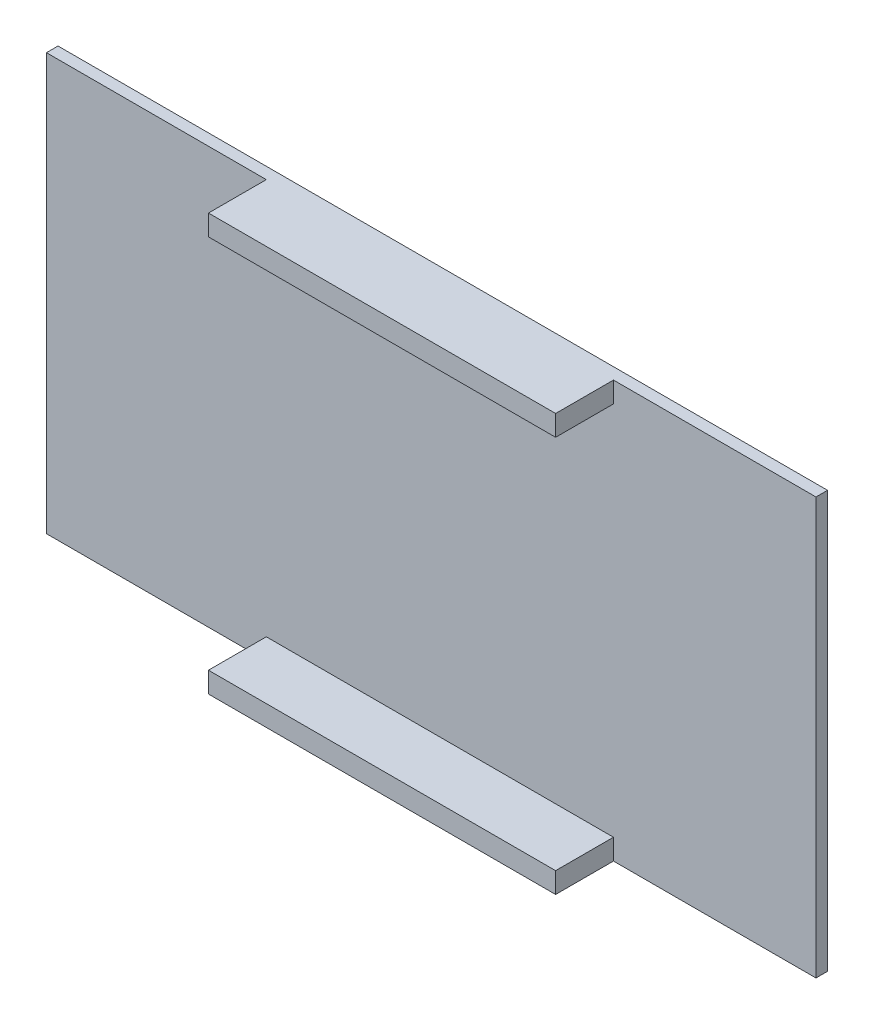
ISO-10303-21;
HEADER;
FILE_DESCRIPTION(('STEP AP214'),'2;1');
FILE_NAME('part.step','',(''),(''),'','','');
FILE_SCHEMA(('AUTOMOTIVE_DESIGN { 1 0 10303 214 1 1 1 1 }'));
ENDSEC;
DATA;
#1=APPLICATION_CONTEXT('core data for automotive mechanical design processes');
#2=APPLICATION_PROTOCOL_DEFINITION('international standard','automotive_design',2000,#1);
#3=PRODUCT_CONTEXT('',#1,'mechanical');
#4=PRODUCT('Part','Part','',(#3));
#5=PRODUCT_RELATED_PRODUCT_CATEGORY('part','',(#4));
#6=PRODUCT_DEFINITION_FORMATION('','',#4);
#7=PRODUCT_DEFINITION_CONTEXT('part definition',#1,'design');
#8=PRODUCT_DEFINITION('design','',#6,#7);
#9=PRODUCT_DEFINITION_SHAPE('','',#8);
#10=(LENGTH_UNIT() NAMED_UNIT(*) SI_UNIT(.MILLI.,.METRE.));
#11=(NAMED_UNIT(*) PLANE_ANGLE_UNIT() SI_UNIT($,.RADIAN.));
#12=(NAMED_UNIT(*) SI_UNIT($,.STERADIAN.) SOLID_ANGLE_UNIT());
#13=UNCERTAINTY_MEASURE_WITH_UNIT(LENGTH_MEASURE(1.E-05),#10,'distance_accuracy_value','');
#14=(GEOMETRIC_REPRESENTATION_CONTEXT(3) GLOBAL_UNCERTAINTY_ASSIGNED_CONTEXT((#13)) GLOBAL_UNIT_ASSIGNED_CONTEXT((#10,
#11,#12)) REPRESENTATION_CONTEXT('',''));
#15=CARTESIAN_POINT('',(0.,0.,0.));
#16=DIRECTION('',(0.,0.,1.));
#17=DIRECTION('',(1.,0.,0.));
#18=AXIS2_PLACEMENT_3D('',#15,#16,#17);
#19=CARTESIAN_POINT('',(0.,0.,2.));
#20=DIRECTION('',(0.,0.,-1.));
#21=DIRECTION('',(-1.,0.,0.));
#22=AXIS2_PLACEMENT_3D('',#19,#20,#21);
#23=PLANE('',#22);
#24=DIRECTION('',(1.,0.,0.));
#25=VECTOR('',#24,1.);
#26=CARTESIAN_POINT('',(-66.5,-36.,2.));
#27=LINE('',#26,#25);
#28=CARTESIAN_POINT('',(-66.5,-36.,2.));
#29=VERTEX_POINT('',#28);
#30=CARTESIAN_POINT('',(-28.5,-36.,2.));
#31=VERTEX_POINT('',#30);
#32=EDGE_CURVE('E211',#29,#31,#27,.T.);
#33=ORIENTED_EDGE('',*,*,#32,.T.);
#34=DIRECTION('',(0.,1.,0.));
#35=VECTOR('',#34,1.);
#36=CARTESIAN_POINT('',(-28.5,-36.,2.));
#37=LINE('',#36,#35);
#38=CARTESIAN_POINT('',(-28.5,-32.4297746310813,2.));
#39=VERTEX_POINT('',#38);
#40=EDGE_CURVE('E55',#31,#39,#37,.T.);
#41=ORIENTED_EDGE('',*,*,#40,.T.);
#42=DIRECTION('',(1.,0.,0.));
#43=VECTOR('',#42,1.);
#44=CARTESIAN_POINT('',(-28.5,-32.4297746310813,2.));
#45=LINE('',#44,#43);
#46=CARTESIAN_POINT('',(31.5,-32.4297746310813,2.));
#47=VERTEX_POINT('',#46);
#48=EDGE_CURVE('E50',#39,#47,#45,.T.);
#49=ORIENTED_EDGE('',*,*,#48,.T.);
#50=DIRECTION('',(0.,-1.,0.));
#51=VECTOR('',#50,1.);
#52=CARTESIAN_POINT('',(31.5,-36.,2.));
#53=LINE('',#52,#51);
#54=CARTESIAN_POINT('',(31.5,-36.,2.));
#55=VERTEX_POINT('',#54);
#56=EDGE_CURVE('E153',#47,#55,#53,.T.);
#57=ORIENTED_EDGE('',*,*,#56,.T.);
#58=CARTESIAN_POINT('',(66.5,-36.,2.));
#59=VERTEX_POINT('',#58);
#60=EDGE_CURVE('E210',#55,#59,#27,.T.);
#61=ORIENTED_EDGE('',*,*,#60,.T.);
#62=DIRECTION('',(0.,1.,0.));
#63=VECTOR('',#62,1.);
#64=CARTESIAN_POINT('',(66.5,-36.,2.));
#65=LINE('',#64,#63);
#66=CARTESIAN_POINT('',(66.5,36.,2.));
#67=VERTEX_POINT('',#66);
#68=EDGE_CURVE('E203',#59,#67,#65,.T.);
#69=ORIENTED_EDGE('',*,*,#68,.T.);
#70=DIRECTION('',(-1.,0.,0.));
#71=VECTOR('',#70,1.);
#72=CARTESIAN_POINT('',(-66.5,36.,2.));
#73=LINE('',#72,#71);
#74=CARTESIAN_POINT('',(31.5,36.,2.));
#75=VERTEX_POINT('',#74);
#76=EDGE_CURVE('E202',#67,#75,#73,.T.);
#77=ORIENTED_EDGE('',*,*,#76,.T.);
#78=DIRECTION('',(0.,1.,0.));
#79=VECTOR('',#78,1.);
#80=CARTESIAN_POINT('',(31.5,36.,2.));
#81=LINE('',#80,#79);
#82=CARTESIAN_POINT('',(31.5,32.4297746310813,2.));
#83=VERTEX_POINT('',#82);
#84=EDGE_CURVE('E164',#83,#75,#81,.T.);
#85=ORIENTED_EDGE('',*,*,#84,.F.);
#86=DIRECTION('',(1.,0.,0.));
#87=VECTOR('',#86,1.);
#88=CARTESIAN_POINT('',(-28.5,32.4297746310813,2.));
#89=LINE('',#88,#87);
#90=CARTESIAN_POINT('',(-28.5,32.4297746310813,2.));
#91=VERTEX_POINT('',#90);
#92=EDGE_CURVE('E171',#91,#83,#89,.T.);
#93=ORIENTED_EDGE('',*,*,#92,.F.);
#94=DIRECTION('',(0.,-1.,0.));
#95=VECTOR('',#94,1.);
#96=CARTESIAN_POINT('',(-28.5,36.,2.));
#97=LINE('',#96,#95);
#98=CARTESIAN_POINT('',(-28.5,36.,2.));
#99=VERTEX_POINT('',#98);
#100=EDGE_CURVE('E132',#99,#91,#97,.T.);
#101=ORIENTED_EDGE('',*,*,#100,.F.);
#102=CARTESIAN_POINT('',(-66.5,36.,2.));
#103=VERTEX_POINT('',#102);
#104=EDGE_CURVE('E199',#99,#103,#73,.T.);
#105=ORIENTED_EDGE('',*,*,#104,.T.);
#106=DIRECTION('',(0.,-1.,0.));
#107=VECTOR('',#106,1.);
#108=CARTESIAN_POINT('',(-66.5,-36.,2.));
#109=LINE('',#108,#107);
#110=EDGE_CURVE('E207',#103,#29,#109,.T.);
#111=ORIENTED_EDGE('',*,*,#110,.T.);
#112=EDGE_LOOP('',(#33,#41,#49,#57,#61,#69,#77,#85,#93,#101,#105,#111));
#113=FACE_BOUND('',#112,.T.);
#114=ADVANCED_FACE('F33',(#113),#23,.F.);
#115=CARTESIAN_POINT('',(66.5,-36.,2.));
#116=DIRECTION('',(-1.,0.,0.));
#117=DIRECTION('',(0.,0.,1.));
#118=AXIS2_PLACEMENT_3D('',#115,#116,#117);
#119=PLANE('',#118);
#120=DIRECTION('',(0.,1.,0.));
#121=VECTOR('',#120,1.);
#122=CARTESIAN_POINT('',(66.5,-36.,0.));
#123=LINE('',#122,#121);
#124=CARTESIAN_POINT('',(66.5,-36.,0.));
#125=VERTEX_POINT('',#124);
#126=CARTESIAN_POINT('',(66.5,36.,0.));
#127=VERTEX_POINT('',#126);
#128=EDGE_CURVE('E214',#125,#127,#123,.T.);
#129=ORIENTED_EDGE('',*,*,#128,.T.);
#130=DIRECTION('',(0.,0.,-1.));
#131=VECTOR('',#130,1.);
#132=CARTESIAN_POINT('',(66.5,36.,2.));
#133=LINE('',#132,#131);
#134=EDGE_CURVE('E11',#67,#127,#133,.T.);
#135=ORIENTED_EDGE('',*,*,#134,.F.);
#136=ORIENTED_EDGE('',*,*,#68,.F.);
#137=DIRECTION('',(0.,0.,-1.));
#138=VECTOR('',#137,1.);
#139=CARTESIAN_POINT('',(66.5,-36.,2.));
#140=LINE('',#139,#138);
#141=EDGE_CURVE('E213',#59,#125,#140,.T.);
#142=ORIENTED_EDGE('',*,*,#141,.T.);
#143=EDGE_LOOP('',(#129,#135,#136,#142));
#144=FACE_BOUND('',#143,.T.);
#145=ADVANCED_FACE('F35',(#144),#119,.F.);
#146=CARTESIAN_POINT('',(-66.5,36.,2.));
#147=DIRECTION('',(0.,-1.,0.));
#148=DIRECTION('',(0.,0.,-1.));
#149=AXIS2_PLACEMENT_3D('',#146,#147,#148);
#150=PLANE('',#149);
#151=DIRECTION('',(-1.,0.,0.));
#152=VECTOR('',#151,1.);
#153=CARTESIAN_POINT('',(-66.5,36.,0.));
#154=LINE('',#153,#152);
#155=CARTESIAN_POINT('',(-66.5,36.,0.));
#156=VERTEX_POINT('',#155);
#157=EDGE_CURVE('E217',#127,#156,#154,.T.);
#158=ORIENTED_EDGE('',*,*,#157,.T.);
#159=DIRECTION('',(0.,0.,-1.));
#160=VECTOR('',#159,1.);
#161=CARTESIAN_POINT('',(-66.5,36.,2.));
#162=LINE('',#161,#160);
#163=EDGE_CURVE('E42',#103,#156,#162,.T.);
#164=ORIENTED_EDGE('',*,*,#163,.F.);
#165=ORIENTED_EDGE('',*,*,#104,.F.);
#166=DIRECTION('',(0.,0.,-1.));
#167=VECTOR('',#166,1.);
#168=CARTESIAN_POINT('',(-28.5,36.,12.));
#169=LINE('',#168,#167);
#170=CARTESIAN_POINT('',(-28.5,36.,12.));
#171=VERTEX_POINT('',#170);
#172=EDGE_CURVE('E170',#171,#99,#169,.T.);
#173=ORIENTED_EDGE('',*,*,#172,.F.);
#174=DIRECTION('',(-1.,0.,0.));
#175=VECTOR('',#174,1.);
#176=CARTESIAN_POINT('',(-28.5,36.,12.));
#177=LINE('',#176,#175);
#178=CARTESIAN_POINT('',(31.5,36.,12.));
#179=VERTEX_POINT('',#178);
#180=EDGE_CURVE('E168',#179,#171,#177,.T.);
#181=ORIENTED_EDGE('',*,*,#180,.F.);
#182=DIRECTION('',(0.,0.,-1.));
#183=VECTOR('',#182,1.);
#184=CARTESIAN_POINT('',(31.5,36.,12.));
#185=LINE('',#184,#183);
#186=EDGE_CURVE('E183',#179,#75,#185,.T.);
#187=ORIENTED_EDGE('',*,*,#186,.T.);
#188=ORIENTED_EDGE('',*,*,#76,.F.);
#189=ORIENTED_EDGE('',*,*,#134,.T.);
#190=EDGE_LOOP('',(#158,#164,#165,#173,#181,#187,#188,#189));
#191=FACE_BOUND('',#190,.T.);
#192=ADVANCED_FACE('F263',(#191),#150,.F.);
#193=CARTESIAN_POINT('',(-66.5,-36.,2.));
#194=DIRECTION('',(1.,0.,0.));
#195=DIRECTION('',(0.,0.,-1.));
#196=AXIS2_PLACEMENT_3D('',#193,#194,#195);
#197=PLANE('',#196);
#198=DIRECTION('',(0.,-1.,0.));
#199=VECTOR('',#198,1.);
#200=CARTESIAN_POINT('',(-66.5,-36.,0.));
#201=LINE('',#200,#199);
#202=CARTESIAN_POINT('',(-66.5,-36.,0.));
#203=VERTEX_POINT('',#202);
#204=EDGE_CURVE('E219',#156,#203,#201,.T.);
#205=ORIENTED_EDGE('',*,*,#204,.T.);
#206=DIRECTION('',(0.,0.,-1.));
#207=VECTOR('',#206,1.);
#208=CARTESIAN_POINT('',(-66.5,-36.,2.));
#209=LINE('',#208,#207);
#210=EDGE_CURVE('E225',#29,#203,#209,.T.);
#211=ORIENTED_EDGE('',*,*,#210,.F.);
#212=ORIENTED_EDGE('',*,*,#110,.F.);
#213=ORIENTED_EDGE('',*,*,#163,.T.);
#214=EDGE_LOOP('',(#205,#211,#212,#213));
#215=FACE_BOUND('',#214,.T.);
#216=ADVANCED_FACE('F233',(#215),#197,.F.);
#217=CARTESIAN_POINT('',(-66.5,-36.,2.));
#218=DIRECTION('',(0.,1.,0.));
#219=DIRECTION('',(0.,0.,1.));
#220=AXIS2_PLACEMENT_3D('',#217,#218,#219);
#221=PLANE('',#220);
#222=DIRECTION('',(1.,0.,0.));
#223=VECTOR('',#222,1.);
#224=CARTESIAN_POINT('',(-66.5,-36.,0.));
#225=LINE('',#224,#223);
#226=EDGE_CURVE('E221',#203,#125,#225,.T.);
#227=ORIENTED_EDGE('',*,*,#226,.T.);
#228=ORIENTED_EDGE('',*,*,#141,.F.);
#229=ORIENTED_EDGE('',*,*,#60,.F.);
#230=DIRECTION('',(0.,0.,-1.));
#231=VECTOR('',#230,1.);
#232=CARTESIAN_POINT('',(31.5,-36.,12.));
#233=LINE('',#232,#231);
#234=CARTESIAN_POINT('',(31.5,-36.,12.));
#235=VERTEX_POINT('',#234);
#236=EDGE_CURVE('E133',#235,#55,#233,.T.);
#237=ORIENTED_EDGE('',*,*,#236,.F.);
#238=DIRECTION('',(-1.,0.,0.));
#239=VECTOR('',#238,1.);
#240=CARTESIAN_POINT('',(-28.5,-36.,12.));
#241=LINE('',#240,#239);
#242=CARTESIAN_POINT('',(-28.5,-36.,12.));
#243=VERTEX_POINT('',#242);
#244=EDGE_CURVE('E139',#235,#243,#241,.T.);
#245=ORIENTED_EDGE('',*,*,#244,.T.);
#246=DIRECTION('',(0.,0.,-1.));
#247=VECTOR('',#246,1.);
#248=CARTESIAN_POINT('',(-28.5,-36.,12.));
#249=LINE('',#248,#247);
#250=EDGE_CURVE('E124',#243,#31,#249,.T.);
#251=ORIENTED_EDGE('',*,*,#250,.T.);
#252=ORIENTED_EDGE('',*,*,#32,.F.);
#253=ORIENTED_EDGE('',*,*,#210,.T.);
#254=EDGE_LOOP('',(#227,#228,#229,#237,#245,#251,#252,#253));
#255=FACE_BOUND('',#254,.T.);
#256=ADVANCED_FACE('F144',(#255),#221,.F.);
#257=CARTESIAN_POINT('',(0.,0.,0.));
#258=DIRECTION('',(0.,0.,-1.));
#259=DIRECTION('',(-1.,0.,0.));
#260=AXIS2_PLACEMENT_3D('',#257,#258,#259);
#261=PLANE('',#260);
#262=ORIENTED_EDGE('',*,*,#128,.F.);
#263=ORIENTED_EDGE('',*,*,#226,.F.);
#264=ORIENTED_EDGE('',*,*,#204,.F.);
#265=ORIENTED_EDGE('',*,*,#157,.F.);
#266=EDGE_LOOP('',(#262,#263,#264,#265));
#267=FACE_BOUND('',#266,.T.);
#268=ADVANCED_FACE('F239',(#267),#261,.T.);
#269=CARTESIAN_POINT('',(-28.5,36.,12.));
#270=DIRECTION('',(1.,0.,0.));
#271=DIRECTION('',(0.,0.,-1.));
#272=AXIS2_PLACEMENT_3D('',#269,#270,#271);
#273=PLANE('',#272);
#274=ORIENTED_EDGE('',*,*,#100,.T.);
#275=DIRECTION('',(0.,0.,-1.));
#276=VECTOR('',#275,1.);
#277=CARTESIAN_POINT('',(-28.5,32.4297746310813,12.));
#278=LINE('',#277,#276);
#279=CARTESIAN_POINT('',(-28.5,32.4297746310813,12.));
#280=VERTEX_POINT('',#279);
#281=EDGE_CURVE('E189',#280,#91,#278,.T.);
#282=ORIENTED_EDGE('',*,*,#281,.F.);
#283=DIRECTION('',(0.,-1.,0.));
#284=VECTOR('',#283,1.);
#285=CARTESIAN_POINT('',(-28.5,36.,12.));
#286=LINE('',#285,#284);
#287=EDGE_CURVE('E160',#171,#280,#286,.T.);
#288=ORIENTED_EDGE('',*,*,#287,.F.);
#289=ORIENTED_EDGE('',*,*,#172,.T.);
#290=EDGE_LOOP('',(#274,#282,#288,#289));
#291=FACE_BOUND('',#290,.T.);
#292=ADVANCED_FACE('F266',(#291),#273,.F.);
#293=CARTESIAN_POINT('',(-28.5,32.4297746310813,12.));
#294=DIRECTION('',(0.,1.,0.));
#295=DIRECTION('',(-1.,0.,0.));
#296=AXIS2_PLACEMENT_3D('',#293,#294,#295);
#297=PLANE('',#296);
#298=ORIENTED_EDGE('',*,*,#92,.T.);
#299=DIRECTION('',(0.,0.,-1.));
#300=VECTOR('',#299,1.);
#301=CARTESIAN_POINT('',(31.5,32.4297746310813,12.));
#302=LINE('',#301,#300);
#303=CARTESIAN_POINT('',(31.5,32.4297746310813,12.));
#304=VERTEX_POINT('',#303);
#305=EDGE_CURVE('E176',#304,#83,#302,.T.);
#306=ORIENTED_EDGE('',*,*,#305,.F.);
#307=DIRECTION('',(1.,0.,0.));
#308=VECTOR('',#307,1.);
#309=CARTESIAN_POINT('',(-28.5,32.4297746310813,12.));
#310=LINE('',#309,#308);
#311=EDGE_CURVE('E163',#280,#304,#310,.T.);
#312=ORIENTED_EDGE('',*,*,#311,.F.);
#313=ORIENTED_EDGE('',*,*,#281,.T.);
#314=EDGE_LOOP('',(#298,#306,#312,#313));
#315=FACE_BOUND('',#314,.T.);
#316=ADVANCED_FACE('F297',(#315),#297,.F.);
#317=CARTESIAN_POINT('',(31.5,36.,12.));
#318=DIRECTION('',(-1.,0.,0.));
#319=DIRECTION('',(0.,0.,1.));
#320=AXIS2_PLACEMENT_3D('',#317,#318,#319);
#321=PLANE('',#320);
#322=ORIENTED_EDGE('',*,*,#84,.T.);
#323=ORIENTED_EDGE('',*,*,#186,.F.);
#324=DIRECTION('',(0.,1.,0.));
#325=VECTOR('',#324,1.);
#326=CARTESIAN_POINT('',(31.5,36.,12.));
#327=LINE('',#326,#325);
#328=EDGE_CURVE('E166',#304,#179,#327,.T.);
#329=ORIENTED_EDGE('',*,*,#328,.F.);
#330=ORIENTED_EDGE('',*,*,#305,.T.);
#331=EDGE_LOOP('',(#322,#323,#329,#330));
#332=FACE_BOUND('',#331,.T.);
#333=ADVANCED_FACE('F303',(#332),#321,.F.);
#334=CARTESIAN_POINT('',(0.,0.,12.));
#335=DIRECTION('',(0.,0.,1.));
#336=DIRECTION('',(1.,0.,0.));
#337=AXIS2_PLACEMENT_3D('',#334,#335,#336);
#338=PLANE('',#337);
#339=ORIENTED_EDGE('',*,*,#287,.T.);
#340=ORIENTED_EDGE('',*,*,#311,.T.);
#341=ORIENTED_EDGE('',*,*,#328,.T.);
#342=ORIENTED_EDGE('',*,*,#180,.T.);
#343=EDGE_LOOP('',(#339,#340,#341,#342));
#344=FACE_BOUND('',#343,.T.);
#345=ADVANCED_FACE('F310',(#344),#338,.T.);
#346=CARTESIAN_POINT('',(-28.5,-36.,12.));
#347=DIRECTION('',(-1.,0.,0.));
#348=DIRECTION('',(0.,0.,1.));
#349=AXIS2_PLACEMENT_3D('',#346,#347,#348);
#350=PLANE('',#349);
#351=ORIENTED_EDGE('',*,*,#40,.F.);
#352=ORIENTED_EDGE('',*,*,#250,.F.);
#353=DIRECTION('',(0.,1.,0.));
#354=VECTOR('',#353,1.);
#355=CARTESIAN_POINT('',(-28.5,-36.,12.));
#356=LINE('',#355,#354);
#357=CARTESIAN_POINT('',(-28.5,-32.4297746310813,12.));
#358=VERTEX_POINT('',#357);
#359=EDGE_CURVE('E127',#243,#358,#356,.T.);
#360=ORIENTED_EDGE('',*,*,#359,.T.);
#361=DIRECTION('',(0.,0.,-1.));
#362=VECTOR('',#361,1.);
#363=CARTESIAN_POINT('',(-28.5,-32.4297746310813,12.));
#364=LINE('',#363,#362);
#365=EDGE_CURVE('E151',#358,#39,#364,.T.);
#366=ORIENTED_EDGE('',*,*,#365,.T.);
#367=EDGE_LOOP('',(#351,#352,#360,#366));
#368=FACE_BOUND('',#367,.T.);
#369=ADVANCED_FACE('F126',(#368),#350,.T.);
#370=CARTESIAN_POINT('',(31.5,-36.,12.));
#371=DIRECTION('',(1.,0.,0.));
#372=DIRECTION('',(0.,0.,-1.));
#373=AXIS2_PLACEMENT_3D('',#370,#371,#372);
#374=PLANE('',#373);
#375=ORIENTED_EDGE('',*,*,#56,.F.);
#376=DIRECTION('',(0.,0.,-1.));
#377=VECTOR('',#376,1.);
#378=CARTESIAN_POINT('',(31.5,-32.4297746310813,12.));
#379=LINE('',#378,#377);
#380=CARTESIAN_POINT('',(31.5,-32.4297746310813,12.));
#381=VERTEX_POINT('',#380);
#382=EDGE_CURVE('E157',#381,#47,#379,.T.);
#383=ORIENTED_EDGE('',*,*,#382,.F.);
#384=DIRECTION('',(0.,-1.,0.));
#385=VECTOR('',#384,1.);
#386=CARTESIAN_POINT('',(31.5,-36.,12.));
#387=LINE('',#386,#385);
#388=EDGE_CURVE('E146',#381,#235,#387,.T.);
#389=ORIENTED_EDGE('',*,*,#388,.T.);
#390=ORIENTED_EDGE('',*,*,#236,.T.);
#391=EDGE_LOOP('',(#375,#383,#389,#390));
#392=FACE_BOUND('',#391,.T.);
#393=ADVANCED_FACE('F247',(#392),#374,.T.);
#394=CARTESIAN_POINT('',(-28.5,-32.4297746310813,12.));
#395=DIRECTION('',(0.,1.,0.));
#396=DIRECTION('',(-1.,0.,0.));
#397=AXIS2_PLACEMENT_3D('',#394,#395,#396);
#398=PLANE('',#397);
#399=ORIENTED_EDGE('',*,*,#48,.F.);
#400=ORIENTED_EDGE('',*,*,#365,.F.);
#401=DIRECTION('',(1.,0.,0.));
#402=VECTOR('',#401,1.);
#403=CARTESIAN_POINT('',(-28.5,-32.4297746310813,12.));
#404=LINE('',#403,#402);
#405=EDGE_CURVE('E142',#358,#381,#404,.T.);
#406=ORIENTED_EDGE('',*,*,#405,.T.);
#407=ORIENTED_EDGE('',*,*,#382,.T.);
#408=EDGE_LOOP('',(#399,#400,#406,#407));
#409=FACE_BOUND('',#408,.T.);
#410=ADVANCED_FACE('F249',(#409),#398,.T.);
#411=CARTESIAN_POINT('',(0.,0.,12.));
#412=DIRECTION('',(0.,0.,1.));
#413=DIRECTION('',(1.,0.,0.));
#414=AXIS2_PLACEMENT_3D('',#411,#412,#413);
#415=PLANE('',#414);
#416=ORIENTED_EDGE('',*,*,#359,.F.);
#417=ORIENTED_EDGE('',*,*,#244,.F.);
#418=ORIENTED_EDGE('',*,*,#388,.F.);
#419=ORIENTED_EDGE('',*,*,#405,.F.);
#420=EDGE_LOOP('',(#416,#417,#418,#419));
#421=FACE_BOUND('',#420,.T.);
#422=ADVANCED_FACE('F137',(#421),#415,.T.);
#423=CLOSED_SHELL('',(#114,#145,#192,#216,#256,#268,#292,#316,#333,#345,#369,#393,#410,#422));
#424=MANIFOLD_SOLID_BREP('B2',#423);
#425=ADVANCED_BREP_SHAPE_REPRESENTATION('',(#18,#424),#14);
#426=SHAPE_DEFINITION_REPRESENTATION(#9,#425);
ENDSEC;
END-ISO-10303-21;
